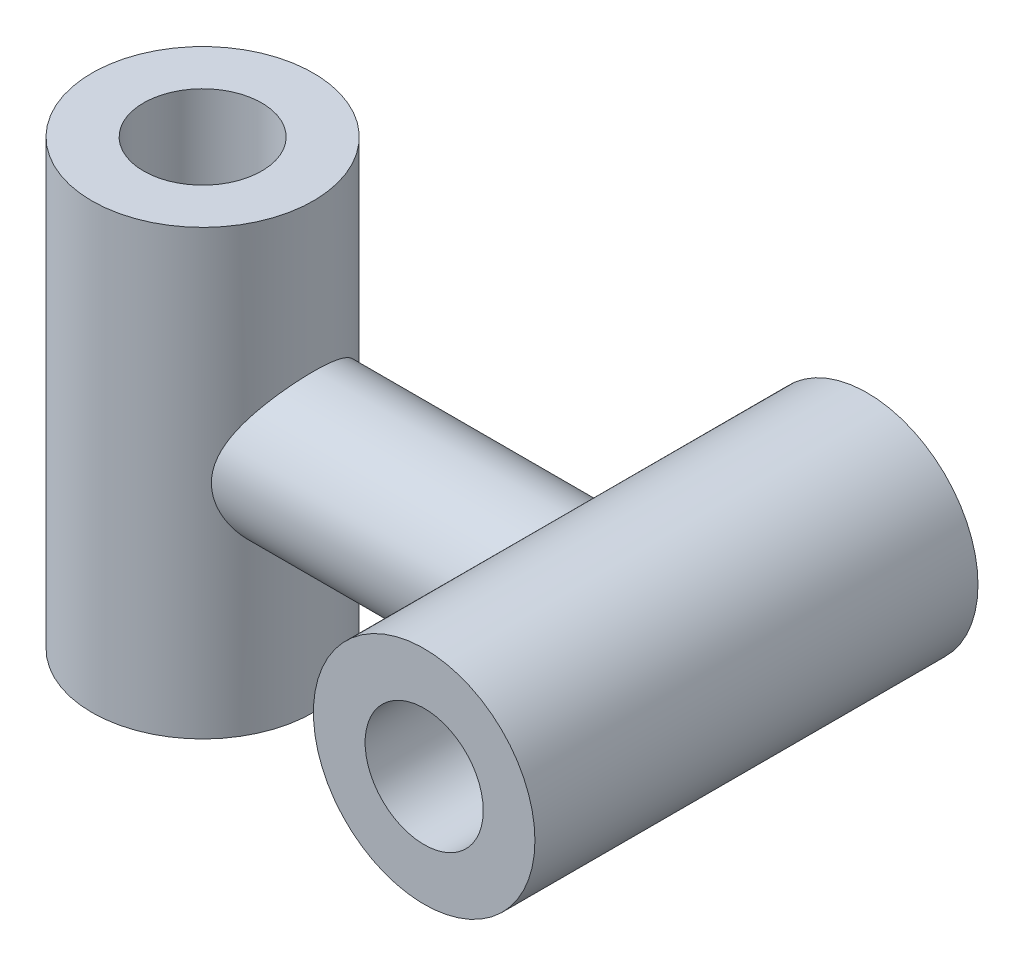
ISO-10303-21;
HEADER;
FILE_DESCRIPTION(('STEP AP214'),'2;1');
FILE_NAME('part.step','',(''),(''),'','','');
FILE_SCHEMA(('AUTOMOTIVE_DESIGN { 1 0 10303 214 1 1 1 1 }'));
ENDSEC;
DATA;
#1=APPLICATION_CONTEXT('core data for automotive mechanical design processes');
#2=APPLICATION_PROTOCOL_DEFINITION('international standard','automotive_design',2000,#1);
#3=PRODUCT_CONTEXT('',#1,'mechanical');
#4=PRODUCT('Part','Part','',(#3));
#5=PRODUCT_RELATED_PRODUCT_CATEGORY('part','',(#4));
#6=PRODUCT_DEFINITION_FORMATION('','',#4);
#7=PRODUCT_DEFINITION_CONTEXT('part definition',#1,'design');
#8=PRODUCT_DEFINITION('design','',#6,#7);
#9=PRODUCT_DEFINITION_SHAPE('','',#8);
#10=(LENGTH_UNIT() NAMED_UNIT(*) SI_UNIT(.MILLI.,.METRE.));
#11=(NAMED_UNIT(*) PLANE_ANGLE_UNIT() SI_UNIT($,.RADIAN.));
#12=(NAMED_UNIT(*) SI_UNIT($,.STERADIAN.) SOLID_ANGLE_UNIT());
#13=UNCERTAINTY_MEASURE_WITH_UNIT(LENGTH_MEASURE(1.E-05),#10,'distance_accuracy_value','');
#14=(GEOMETRIC_REPRESENTATION_CONTEXT(3) GLOBAL_UNCERTAINTY_ASSIGNED_CONTEXT((#13)) GLOBAL_UNIT_ASSIGNED_CONTEXT((#10,
#11,#12)) REPRESENTATION_CONTEXT('',''));
#15=CARTESIAN_POINT('',(0.,0.,0.));
#16=DIRECTION('',(0.,0.,1.));
#17=DIRECTION('',(1.,0.,0.));
#18=AXIS2_PLACEMENT_3D('',#15,#16,#17);
#19=CARTESIAN_POINT('',(0.,30.,0.));
#20=DIRECTION('',(0.,-1.,0.));
#21=DIRECTION('',(0.,0.,-1.));
#22=AXIS2_PLACEMENT_3D('',#19,#20,#21);
#23=CYLINDRICAL_SURFACE('',#22,15.);
#24=CARTESIAN_POINT('',(0.,30.,0.));
#25=DIRECTION('',(0.,1.,0.));
#26=DIRECTION('',(0.,0.,1.));
#27=AXIS2_PLACEMENT_3D('',#24,#25,#26);
#28=CIRCLE('',#27,15.);
#29=CARTESIAN_POINT('',(0.,30.,15.));
#30=VERTEX_POINT('',#29);
#31=EDGE_CURVE('E44',#30,#30,#28,.T.);
#32=ORIENTED_EDGE('',*,*,#31,.F.);
#33=EDGE_LOOP('',(#32));
#34=FACE_BOUND('',#33,.T.);
#35=CARTESIAN_POINT('',(0.,-30.,0.));
#36=DIRECTION('',(0.,1.,0.));
#37=DIRECTION('',(0.,0.,1.));
#38=AXIS2_PLACEMENT_3D('',#35,#36,#37);
#39=CIRCLE('',#38,15.);
#40=CARTESIAN_POINT('',(0.,-30.,15.));
#41=VERTEX_POINT('',#40);
#42=EDGE_CURVE('E48',#41,#41,#39,.T.);
#43=ORIENTED_EDGE('',*,*,#42,.T.);
#44=EDGE_LOOP('',(#43));
#45=FACE_BOUND('',#44,.T.);
#46=CARTESIAN_POINT('',(11.1803398874989,0.,10.));
#47=CARTESIAN_POINT('',(11.1803430259406,-0.244104634083735,9.99999812169869));
#48=CARTESIAN_POINT('',(11.1883710861167,-0.488234877021476,9.99104298688126));
#49=CARTESIAN_POINT('',(11.2200794062258,-0.9741786748761,9.95541902056754));
#50=CARTESIAN_POINT('',(11.2437621621503,-1.21599185412102,9.92874736433802));
#51=CARTESIAN_POINT('',(11.3056682657664,-1.69550479304914,9.85819750719936));
#52=CARTESIAN_POINT('',(11.3439099993903,-1.93319895251672,9.81429754720628));
#53=CARTESIAN_POINT('',(11.4332421002341,-2.40254294819922,9.71008060552601));
#54=CARTESIAN_POINT('',(11.4843390943081,-2.63418959874925,9.64975515521691));
#55=CARTESIAN_POINT('',(11.6527900284438,-3.31335090278491,9.4468623449172));
#56=CARTESIAN_POINT('',(11.7860548834697,-3.75031310169313,9.28157856239411));
#57=CARTESIAN_POINT('',(12.0792279451741,-4.5894545697837,8.89665774912812));
#58=CARTESIAN_POINT('',(12.2391416827651,-4.99162659197015,8.67700943055291));
#59=CARTESIAN_POINT('',(12.5013264947166,-5.59668354535961,8.29133076792019));
#60=CARTESIAN_POINT('',(12.5994659827145,-5.81208580089952,8.14175321020326));
#61=CARTESIAN_POINT('',(12.7975948813315,-6.22995308437642,7.82663116288371));
#62=CARTESIAN_POINT('',(12.8975839505731,-6.4324204695781,7.66108959645801));
#63=CARTESIAN_POINT('',(13.0973129788288,-6.82407478250954,7.31440150407201));
#64=CARTESIAN_POINT('',(13.1970525692878,-7.01324763966897,7.13323888356034));
#65=CARTESIAN_POINT('',(13.3941287851115,-7.37740647406724,6.75593222846197));
#66=CARTESIAN_POINT('',(13.491465244404,-7.55239147273011,6.55978716230338));
#67=CARTESIAN_POINT('',(13.6955602327301,-7.91159105003276,6.12353647276973));
#68=CARTESIAN_POINT('',(13.8016407482454,-8.09346990419511,5.8811789501792));
#69=CARTESIAN_POINT('',(14.0051991409564,-8.43590832447264,5.37846826366159));
#70=CARTESIAN_POINT('',(14.1026781086509,-8.59647059439672,5.1181173884048));
#71=CARTESIAN_POINT('',(14.2862255770416,-8.89437994302583,4.58085923760313));
#72=CARTESIAN_POINT('',(14.3723022122588,-9.03174359126861,4.30396397184124));
#73=CARTESIAN_POINT('',(14.5304784366757,-9.28138637708527,3.73526924944096));
#74=CARTESIAN_POINT('',(14.6025810193416,-9.39367088779998,3.44347300179123));
#75=CARTESIAN_POINT('',(14.7232499779965,-9.58011201957957,2.8808291650135));
#76=CARTESIAN_POINT('',(14.7735488698848,-9.6571320762623,2.6113011354144));
#77=CARTESIAN_POINT('',(14.8598203562673,-9.78860194671832,2.0645333689058));
#78=CARTESIAN_POINT('',(14.89579391716,-9.84305328300618,1.78729415354961));
#79=CARTESIAN_POINT('',(14.9522937545745,-9.9283487325306,1.22794421558455));
#80=CARTESIAN_POINT('',(14.9728362005759,-9.95921755725901,0.945838909986497));
#81=CARTESIAN_POINT('',(14.9978816517682,-9.99683236708492,0.379329542124272));
#82=CARTESIAN_POINT('',(15.0023869200542,-10.0035817558104,0.0949258098814438));
#83=CARTESIAN_POINT('',(14.9957738626236,-9.99365946358264,-0.429890300704853));
#84=CARTESIAN_POINT('',(14.9869306329571,-9.98039844294295,-0.670405365119609));
#85=CARTESIAN_POINT('',(14.9578376639306,-9.9366582762118,-1.14916921336002));
#86=CARTESIAN_POINT('',(14.9375881746366,-9.9061795075949,-1.38741804675311));
#87=CARTESIAN_POINT('',(14.8861382248988,-9.82842604583959,-1.85994144315074));
#88=CARTESIAN_POINT('',(14.8549378760396,-9.78115152384267,-2.09421604662547));
#89=CARTESIAN_POINT('',(14.7822617239678,-9.67041911018337,-2.55727832292994));
#90=CARTESIAN_POINT('',(14.7407854766754,-9.60696051911227,-2.78606575815929));
#91=CARTESIAN_POINT('',(14.6486073339022,-9.46491431896903,-3.23586010547906));
#92=CARTESIAN_POINT('',(14.5979453417989,-9.38639206481311,-3.45689591892768));
#93=CARTESIAN_POINT('',(14.4882322586955,-9.21483712594955,-3.89118359906177));
#94=CARTESIAN_POINT('',(14.4291784106703,-9.12179967149181,-4.10443287853565));
#95=CARTESIAN_POINT('',(14.3037704301121,-8.9221009344861,-4.5221336999245));
#96=CARTESIAN_POINT('',(14.2374182594116,-8.81544331188517,-4.72658758563683));
#97=CARTESIAN_POINT('',(14.0984944675164,-8.58926725934447,-5.12613031066347));
#98=CARTESIAN_POINT('',(14.0259206268545,-8.46974423598901,-5.32121576891783));
#99=CARTESIAN_POINT('',(13.8658792207725,-8.20216850951354,-5.726327688562));
#100=CARTESIAN_POINT('',(13.7777061138305,-8.05242961838,-5.93496271084412));
#101=CARTESIAN_POINT('',(13.5965782636545,-7.73843625985692,-6.33893458542772));
#102=CARTESIAN_POINT('',(13.5036213978756,-7.57417532544927,-6.53426544381383));
#103=CARTESIAN_POINT('',(13.3145874937375,-7.23178051029879,-6.91131642999311));
#104=CARTESIAN_POINT('',(13.2185061682784,-7.05362705509659,-7.09301661883702));
#105=CARTESIAN_POINT('',(13.0252308837189,-6.68441263242746,-7.44198477597034));
#106=CARTESIAN_POINT('',(12.928037297742,-6.49335589388961,-7.60925743221258));
#107=CARTESIAN_POINT('',(12.719374739405,-6.06811166266616,-7.95387515273785));
#108=CARTESIAN_POINT('',(12.6080378855717,-5.83183895186575,-8.12873711272969));
#109=CARTESIAN_POINT('',(12.3896668251086,-5.34336756923514,-8.45784659868074));
#110=CARTESIAN_POINT('',(12.2826335903347,-5.09116533284389,-8.61208948645936));
#111=CARTESIAN_POINT('',(12.0766788127789,-4.57196567585117,-8.89859009264868));
#112=CARTESIAN_POINT('',(11.9777446551158,-4.30499239286441,-9.03088234401941));
#113=CARTESIAN_POINT('',(11.7917874904154,-3.75668599376629,-9.27237806459456));
#114=CARTESIAN_POINT('',(11.7047650399248,-3.47535220753653,-9.38158045510896));
#115=CARTESIAN_POINT('',(11.5694871684616,-2.98197209563972,-9.54750949240308));
#116=CARTESIAN_POINT('',(11.5172535222626,-2.77304680410482,-9.61031997608976));
#117=CARTESIAN_POINT('',(11.4226872575468,-2.34953877611093,-9.72253074540317));
#118=CARTESIAN_POINT('',(11.3803483069507,-2.13495975612472,-9.77193961062346));
#119=CARTESIAN_POINT('',(11.3070401848808,-1.70139224710652,-9.85667224549281));
#120=CARTESIAN_POINT('',(11.2760568528539,-1.48240961155064,-9.89201356226248));
#121=CARTESIAN_POINT('',(11.2265751582085,-1.04116868276131,-9.94813645210465));
#122=CARTESIAN_POINT('',(11.208076846047,-0.81891037629326,-9.96891796633514));
#123=CARTESIAN_POINT('',(11.1842832880714,-0.371800856476383,-9.99560576163432));
#124=CARTESIAN_POINT('',(11.1790466259839,-0.146942530983489,-10.0014460405136));
#125=CARTESIAN_POINT('',(11.1821746476658,0.302560059924555,-9.99794852994014));
#126=CARTESIAN_POINT('',(11.1905393640475,0.527204324825155,-9.98861070409458));
#127=CARTESIAN_POINT('',(11.2205177549356,0.974621641486337,-9.95492255357889));
#128=CARTESIAN_POINT('',(11.242140871207,1.19739324495086,-9.93056153029915));
#129=CARTESIAN_POINT('',(11.2977494335487,1.63926939557589,-9.86725009281896));
#130=CARTESIAN_POINT('',(11.3317350862712,1.85837388137277,-9.82829943473768));
#131=CARTESIAN_POINT('',(11.4088330115491,2.28089485594372,-9.73867716321877));
#132=CARTESIAN_POINT('',(11.4514130385869,2.48455237317497,-9.6886776896265));
#133=CARTESIAN_POINT('',(11.5452839732015,2.88648788657469,-9.57662600790573));
#134=CARTESIAN_POINT('',(11.5965778438525,3.08476402616079,-9.51456969891009));
#135=CARTESIAN_POINT('',(11.7614678812668,3.67047748529836,-9.31119036842247));
#136=CARTESIAN_POINT('',(11.88611412818,4.04901435576876,-9.15261057859001));
#137=CARTESIAN_POINT('',(12.1002928870001,4.63234315096139,-8.86571968225689));
#138=CARTESIAN_POINT('',(12.1839462589038,4.84610463934114,-8.75064580817113));
#139=CARTESIAN_POINT('',(12.3558679534822,5.26341966050907,-8.50616497543068));
#140=CARTESIAN_POINT('',(12.444136699054,5.46697225451771,-8.37675670212528));
#141=CARTESIAN_POINT('',(12.6234213220345,5.86362637103519,-8.10406654501133));
#142=CARTESIAN_POINT('',(12.7144400860823,6.05671627224182,-7.96076970794572));
#143=CARTESIAN_POINT('',(12.8973566889103,6.43184385461757,-7.66087764301209));
#144=CARTESIAN_POINT('',(12.9892545762662,6.61388092093514,-7.50428167649493));
#145=CARTESIAN_POINT('',(13.1922876017012,7.00501199367108,-7.14251026043375));
#146=CARTESIAN_POINT('',(13.3032350001165,7.21131788333414,-6.93419991939919));
#147=CARTESIAN_POINT('',(13.521145454981,7.605813647227,-6.49906525353764));
#148=CARTESIAN_POINT('',(13.6281077760494,7.79400018787884,-6.27223753603491));
#149=CARTESIAN_POINT('',(13.8352560142781,8.15079051936007,-5.80102421685026));
#150=CARTESIAN_POINT('',(13.9354465792144,8.3194077996857,-5.55665090006567));
#151=CARTESIAN_POINT('',(14.1264958022064,8.63560945832402,-5.05124190702963));
#152=CARTESIAN_POINT('',(14.217356960693,8.78319947641232,-4.79021072592579));
#153=CARTESIAN_POINT('',(14.3709171071375,9.02943198743409,-4.30448556628466));
#154=CARTESIAN_POINT('',(14.4356734256277,9.13203130163217,-4.08244035052509));
#155=CARTESIAN_POINT('',(14.5561930387882,9.32137816893595,-3.62934795833055));
#156=CARTESIAN_POINT('',(14.6119580128621,9.40812868268456,-3.39830247299899));
#157=CARTESIAN_POINT('',(14.7133038660206,9.564772630882,-2.92854633040624));
#158=CARTESIAN_POINT('',(14.7588912010778,9.63467675373536,-2.68984064278837));
#159=CARTESIAN_POINT('',(14.8389093359148,9.75681098257684,-2.20609679271157));
#160=CARTESIAN_POINT('',(14.8733399738452,9.80904083216604,-1.96105853844224));
#161=CARTESIAN_POINT('',(14.9303555987578,9.89528026301976,-1.46527060531758));
#162=CARTESIAN_POINT('',(14.9528864973692,9.92920666361757,-1.21450016236396));
#163=CARTESIAN_POINT('',(14.9853029119545,9.97795750179072,-0.710289408341561));
#164=CARTESIAN_POINT('',(14.9951884079085,9.9927819091241,-0.456849093046522));
#165=CARTESIAN_POINT('',(15.0020606199943,10.0030913961553,0.0505846961655471));
#166=CARTESIAN_POINT('',(14.999048104548,9.99857762795915,0.304578136228097));
#167=CARTESIAN_POINT('',(14.9802028125407,9.97028527280906,0.810999942975642));
#168=CARTESIAN_POINT('',(14.9643706194314,9.94650756259925,1.0634283803605));
#169=CARTESIAN_POINT('',(14.9218992832392,9.88248971342065,1.54639987516089));
#170=CARTESIAN_POINT('',(14.896131463701,9.84357507465467,1.77719759813669));
#171=CARTESIAN_POINT('',(14.8344725250113,9.75001605952977,2.23418451613698));
#172=CARTESIAN_POINT('',(14.7985819943102,9.69537259751012,2.46037397822816));
#173=CARTESIAN_POINT('',(14.7174040805464,9.5710083281068,2.90680088706522));
#174=CARTESIAN_POINT('',(14.6721176912708,9.50128911523188,3.12703896049922));
#175=CARTESIAN_POINT('',(14.5729891556913,9.34748470402443,3.56054098474612));
#176=CARTESIAN_POINT('',(14.5191436785366,9.26339391189295,3.7738021813197));
#177=CARTESIAN_POINT('',(14.4005595091565,9.07643294016643,4.20435065529125));
#178=CARTESIAN_POINT('',(14.3353729442401,8.97276186320522,4.42116634154645));
#179=CARTESIAN_POINT('',(14.1977124408276,8.7511474570407,4.84506473833997));
#180=CARTESIAN_POINT('',(14.1252354589144,8.63319816311673,5.05214333070681));
#181=CARTESIAN_POINT('',(13.974270364515,8.38391755943982,5.45584279844943));
#182=CARTESIAN_POINT('',(13.8957808577344,8.25258314335166,5.65246123010944));
#183=CARTESIAN_POINT('',(13.7341089343567,7.97735246721627,6.03467657516069));
#184=CARTESIAN_POINT('',(13.6509259922911,7.83345479961898,6.22027224967031));
#185=CARTESIAN_POINT('',(13.4678412146332,7.51020568644261,6.60834585726705));
#186=CARTESIAN_POINT('',(13.3673693594744,7.32883957137959,6.80887991263904));
#187=CARTESIAN_POINT('',(13.1641137688582,6.95120233992227,7.19399132903166));
#188=CARTESIAN_POINT('',(13.0613305240975,6.75493436648316,7.37857203731309));
#189=CARTESIAN_POINT('',(12.8555936943145,6.34800274615306,7.73145903758046));
#190=CARTESIAN_POINT('',(12.7526400392432,6.13732629941372,7.89975052986546));
#191=CARTESIAN_POINT('',(12.5490927023051,5.70233922468843,8.21925441084574));
#192=CARTESIAN_POINT('',(12.4484987926332,5.47802992036076,8.37046845358406));
#193=CARTESIAN_POINT('',(12.2598113631537,5.03390836898575,8.6442187927183));
#194=CARTESIAN_POINT('',(12.1713497005758,4.81505896437095,8.76806290035353));
#195=CARTESIAN_POINT('',(12.0009992344934,4.36657776521144,8.99981674145526));
#196=CARTESIAN_POINT('',(11.9191106288249,4.13694564645788,9.10772599539628));
#197=CARTESIAN_POINT('',(11.7645406627919,3.66788226081282,9.30652559170292));
#198=CARTESIAN_POINT('',(11.691844701299,3.42846735367454,9.397443035655));
#199=CARTESIAN_POINT('',(11.558159950346,2.94041923146926,9.56138824931114));
#200=CARTESIAN_POINT('',(11.4971679739321,2.69178854788988,9.6344208904837));
#201=CARTESIAN_POINT('',(11.401437026276,2.24269134510791,9.74738067057191));
#202=CARTESIAN_POINT('',(11.3638755290469,2.04376372943437,9.79105763878781));
#203=CARTESIAN_POINT('',(11.2985465655896,1.64207066548911,9.8663741573746));
#204=CARTESIAN_POINT('',(11.2707771768695,1.43930597879831,9.89801607069264));
#205=CARTESIAN_POINT('',(11.2259569924442,1.03112886292084,9.94882125186978));
#206=CARTESIAN_POINT('',(11.208901196452,0.82571771465238,9.96799034124066));
#207=CARTESIAN_POINT('',(11.186093076677,0.413543541943227,9.99357852338843));
#208=CARTESIAN_POINT('',(11.180337228926,0.206780959145195,10.0000015911085));
#209=CARTESIAN_POINT('',(11.1803398874989,0.,10.));
#210=B_SPLINE_CURVE_WITH_KNOTS('',3,(#46,#47,#48,#49,#50,#51,#52,#53,#54,#55,#56,#57,#58,#59,
#60,#61,#62,#63,#64,#65,#66,#67,#68,#69,#70,#71,#72,#73,#74,#75,#76,#77,#78,#79,#80,#81,#82,#83,
#84,#85,#86,#87,#88,#89,#90,#91,#92,#93,#94,#95,#96,#97,#98,#99,#100,#101,#102,#103,#104,#105,
#106,#107,#108,#109,#110,#111,#112,#113,#114,#115,#116,#117,#118,#119,#120,#121,#122,#123,#124,
#125,#126,#127,#128,#129,#130,#131,#132,#133,#134,#135,#136,#137,#138,#139,#140,#141,#142,#143,
#144,#145,#146,#147,#148,#149,#150,#151,#152,#153,#154,#155,#156,#157,#158,#159,#160,#161,#162,
#163,#164,#165,#166,#167,#168,#169,#170,#171,#172,#173,#174,#175,#176,#177,#178,#179,#180,#181,
#182,#183,#184,#185,#186,#187,#188,#189,#190,#191,#192,#193,#194,#195,#196,#197,#198,#199,#200,
#201,#202,#203,#204,#205,#206,#207,#208,#209),.UNSPECIFIED.,.T.,.F.,(4,2,2,2,2,2,2,2,2,2,2,2,2,
2,2,2,2,2,2,2,2,2,2,2,2,2,2,2,2,2,2,2,2,2,2,2,2,2,2,2,2,2,2,2,2,2,2,2,2,2,2,2,2,2,2,2,2,2,2,2,2,
2,2,2,2,2,2,2,2,2,2,2,2,2,2,2,2,2,2,2,2,4),(0.,0.732066917349117,1.46425058392996,
2.19736197880351,2.93085206787207,4.382020112657,5.83348971990308,6.672838976924,
7.51203483110182,8.35210589301702,9.19223484776161,10.1540803360742,11.1158037065051,
12.0768372372204,13.0376646710422,13.8907601737504,14.743798116181,15.5959409519091,
16.4479635322652,17.1702156788431,17.8924519916876,18.6146809454662,19.3369411162915,
20.0561358131717,20.7755673398783,21.4948059495621,22.214302210737,23.0280693671007,
23.8422007569148,24.6575007309406,25.4725347827911,26.414397305266,27.356471340832,
28.2970489476923,29.2376704858531,29.9100432897782,30.5819846253405,31.2530851702129,
31.9241884272576,32.5982511716858,33.2723155323322,33.9468604759259,34.6214166957388,
35.2627334392751,35.9042686956598,37.1866749927096,37.9564914842844,38.7263786365849,
39.4971041032807,40.267872404997,41.207188569845,42.1466772201539,43.0855143659072,
44.0240992277863,44.7824339087838,45.5406267835279,46.2983373392933,47.056058886619,
47.8171955242766,48.5783333669519,49.339425864123,50.100483724255,50.806097715443,
51.5116706965499,52.2171690881724,52.922942706437,53.6692292388338,54.4158286150966,
55.1626016537189,55.9094584662437,56.7739254797706,57.6382106720938,58.5032738884594,
59.3682532468017,60.1672315187865,60.9662338294224,61.7639506641025,62.5614499741256,
63.1821889251969,63.8028059381941,64.4231330789218,65.0432667355241),.UNSPECIFIED.);
#211=CARTESIAN_POINT('',(11.1803398874989,0.,10.));
#212=VERTEX_POINT('',#211);
#213=EDGE_CURVE('E10',#212,#212,#210,.T.);
#214=ORIENTED_EDGE('',*,*,#213,.F.);
#215=EDGE_LOOP('',(#214));
#216=FACE_BOUND('',#215,.T.);
#217=ADVANCED_FACE('F33',(#34,#45,#216),#23,.T.);
#218=CARTESIAN_POINT('',(0.,30.,0.));
#219=DIRECTION('',(0.,1.,0.));
#220=DIRECTION('',(0.,0.,1.));
#221=AXIS2_PLACEMENT_3D('',#218,#219,#220);
#222=PLANE('',#221);
#223=ORIENTED_EDGE('',*,*,#31,.T.);
#224=EDGE_LOOP('',(#223));
#225=FACE_BOUND('',#224,.T.);
#226=CARTESIAN_POINT('',(0.,30.,0.));
#227=DIRECTION('',(0.,1.,0.));
#228=DIRECTION('',(0.,0.,1.));
#229=AXIS2_PLACEMENT_3D('',#226,#227,#228);
#230=CIRCLE('',#229,8.);
#231=CARTESIAN_POINT('',(0.,30.,8.));
#232=VERTEX_POINT('',#231);
#233=EDGE_CURVE('E53',#232,#232,#230,.T.);
#234=ORIENTED_EDGE('',*,*,#233,.F.);
#235=EDGE_LOOP('',(#234));
#236=FACE_BOUND('',#235,.T.);
#237=ADVANCED_FACE('F95',(#225,#236),#222,.T.);
#238=CARTESIAN_POINT('',(0.,-30.,0.));
#239=DIRECTION('',(0.,1.,0.));
#240=DIRECTION('',(0.,0.,1.));
#241=AXIS2_PLACEMENT_3D('',#238,#239,#240);
#242=PLANE('',#241);
#243=ORIENTED_EDGE('',*,*,#42,.F.);
#244=EDGE_LOOP('',(#243));
#245=FACE_BOUND('',#244,.T.);
#246=CARTESIAN_POINT('',(0.,-30.,0.));
#247=DIRECTION('',(0.,1.,0.));
#248=DIRECTION('',(0.,0.,1.));
#249=AXIS2_PLACEMENT_3D('',#246,#247,#248);
#250=CIRCLE('',#249,8.);
#251=CARTESIAN_POINT('',(0.,-30.,8.));
#252=VERTEX_POINT('',#251);
#253=EDGE_CURVE('E55',#252,#252,#250,.T.);
#254=ORIENTED_EDGE('',*,*,#253,.T.);
#255=EDGE_LOOP('',(#254));
#256=FACE_BOUND('',#255,.T.);
#257=ADVANCED_FACE('F102',(#245,#256),#242,.F.);
#258=CARTESIAN_POINT('',(0.,30.,0.));
#259=DIRECTION('',(0.,-1.,0.));
#260=DIRECTION('',(0.,0.,-1.));
#261=AXIS2_PLACEMENT_3D('',#258,#259,#260);
#262=CYLINDRICAL_SURFACE('',#261,8.);
#263=ORIENTED_EDGE('',*,*,#233,.T.);
#264=EDGE_LOOP('',(#263));
#265=FACE_BOUND('',#264,.T.);
#266=ORIENTED_EDGE('',*,*,#253,.F.);
#267=EDGE_LOOP('',(#266));
#268=FACE_BOUND('',#267,.T.);
#269=ADVANCED_FACE('F110',(#265,#268),#262,.F.);
#270=CARTESIAN_POINT('',(75.002,0.,0.));
#271=DIRECTION('',(-1.,0.,0.));
#272=DIRECTION('',(0.,0.,1.));
#273=AXIS2_PLACEMENT_3D('',#270,#271,#272);
#274=CYLINDRICAL_SURFACE('',#273,10.);
#275=ORIENTED_EDGE('',*,*,#213,.T.);
#276=EDGE_LOOP('',(#275));
#277=FACE_BOUND('',#276,.T.);
#278=CARTESIAN_POINT('',(45.,0.,10.));
#279=CARTESIAN_POINT('',(45.0000000669645,-0.25121602505803,9.99999993534951));
#280=CARTESIAN_POINT('',(45.0063243617413,-0.502433296411791,9.99052094502158));
#281=CARTESIAN_POINT('',(45.031462274509,-1.00281430621742,9.95275435405694));
#282=CARTESIAN_POINT('',(45.050275958235,-1.25197803385393,9.92446665442466));
#283=CARTESIAN_POINT('',(45.099937392702,-1.74639437147615,9.84950014434954));
#284=CARTESIAN_POINT('',(45.1307898344581,-1.99164541802644,9.80281416477334));
#285=CARTESIAN_POINT('',(45.2037950671594,-2.47636835109205,9.69171976038695));
#286=CARTESIAN_POINT('',(45.2459479947457,-2.71584016768893,9.62731112128079));
#287=CARTESIAN_POINT('',(45.3403774321265,-3.18634157579506,9.48196024055735));
#288=CARTESIAN_POINT('',(45.3926046164158,-3.41740603302261,9.40109845501636));
#289=CARTESIAN_POINT('',(45.5062163332863,-3.87103535608821,9.22357931716256));
#290=CARTESIAN_POINT('',(45.5676008184902,-4.09360026589291,9.12692204657064));
#291=CARTESIAN_POINT('',(45.6983175545653,-4.52919238259836,8.91878234381083));
#292=CARTESIAN_POINT('',(45.7676485304992,-4.74222111188151,8.80730228935662));
#293=CARTESIAN_POINT('',(45.913024921277,-5.15806897823306,8.57039192321527));
#294=CARTESIAN_POINT('',(45.9890728329744,-5.36088427435106,8.44495641940083));
#295=CARTESIAN_POINT('',(46.153204506932,-5.77229179252596,8.16988010712301));
#296=CARTESIAN_POINT('',(46.2417623569089,-5.97992610161554,8.01908981242674));
#297=CARTESIAN_POINT('',(46.4235310029667,-6.38186231730967,7.70306611819707));
#298=CARTESIAN_POINT('',(46.5167437996112,-6.57615840484502,7.5378264854341));
#299=CARTESIAN_POINT('',(46.7061483110135,-6.95109161684713,7.19355182648485));
#300=CARTESIAN_POINT('',(46.8023438277028,-7.13171020600086,7.01449872097468));
#301=CARTESIAN_POINT('',(46.9957106530528,-7.47849345473134,6.6435373382512));
#302=CARTESIAN_POINT('',(47.0928816362889,-7.64466276695229,6.45163323453413));
#303=CARTESIAN_POINT('',(47.3015816678293,-7.98727084465364,6.02411381532355));
#304=CARTESIAN_POINT('',(47.4129517256033,-8.16117931320374,5.78638467561562));
#305=CARTESIAN_POINT('',(47.6311530390378,-8.48824389065339,5.29498288365453));
#306=CARTESIAN_POINT('',(47.7379832603163,-8.64139528736315,5.04130663021886));
#307=CARTESIAN_POINT('',(47.9432463321329,-8.92554542356295,4.51916377060268));
#308=CARTESIAN_POINT('',(48.041692574713,-9.05657983313836,4.25072192372748));
#309=CARTESIAN_POINT('',(48.2263447510574,-9.2953668655437,3.6995014922921));
#310=CARTESIAN_POINT('',(48.3125502429854,-9.4031186480483,3.41672239072095));
#311=CARTESIAN_POINT('',(48.445835592816,-9.56603073076105,2.92197512669334));
#312=CARTESIAN_POINT('',(48.4970252142702,-9.62739262612926,2.71313958691548));
#313=CARTESIAN_POINT('',(48.5894246890727,-9.73672940324514,2.289937274223));
#314=CARTESIAN_POINT('',(48.6306409488442,-9.78471288169701,2.07557415043356));
#315=CARTESIAN_POINT('',(48.7016578564507,-9.86663115695275,1.6425809785492));
#316=CARTESIAN_POINT('',(48.7314726432132,-9.90058335814109,1.42395657095979));
#317=CARTESIAN_POINT('',(48.778612408099,-9.95398099415626,0.983588730911827));
#318=CARTESIAN_POINT('',(48.7959373177741,-9.97342634948116,0.761845281366752));
#319=CARTESIAN_POINT('',(48.8174210972258,-9.99750949727822,0.315986902566632));
#320=CARTESIAN_POINT('',(48.8215251491214,-10.0020856379335,0.0918659554353711));
#321=CARTESIAN_POINT('',(48.8162349155655,-9.9961699136916,-0.356015329671864));
#322=CARTESIAN_POINT('',(48.8068405842626,-9.98567799761094,-0.579775666420325));
#323=CARTESIAN_POINT('',(48.7749456570746,-9.94981025476011,-1.02531254772308));
#324=CARTESIAN_POINT('',(48.7524353227886,-9.92442336863968,-1.24708749379653));
#325=CARTESIAN_POINT('',(48.6952209173834,-9.85920094420808,-1.68688746328602));
#326=CARTESIAN_POINT('',(48.6605166137054,-9.81936513033175,-1.90491241510033));
#327=CARTESIAN_POINT('',(48.5819980905486,-9.72793320006853,-2.32630776900133));
#328=CARTESIAN_POINT('',(48.5386582408607,-9.67693962238987,-2.52989845513065));
#329=CARTESIAN_POINT('',(48.4433431142662,-9.56290804839144,-2.93162712247606));
#330=CARTESIAN_POINT('',(48.3913648957537,-9.49986594811239,-3.12976321936933));
#331=CARTESIAN_POINT('',(48.2245497380555,-9.29354494113033,-3.7149653297061));
#332=CARTESIAN_POINT('',(48.0987895496512,-9.13302364641689,-4.09304089571523));
#333=CARTESIAN_POINT('',(47.8828714872654,-8.84272153741117,-4.67614375859801));
#334=CARTESIAN_POINT('',(47.7984612450931,-8.72612786560377,-4.89016265101236));
#335=CARTESIAN_POINT('',(47.6251282637458,-8.47852404512043,-5.30787405322557));
#336=CARTESIAN_POINT('',(47.5362050991695,-8.34751253601214,-5.51156558590632));
#337=CARTESIAN_POINT('',(47.3557259488922,-8.07152743445186,-5.90837865949047));
#338=CARTESIAN_POINT('',(47.2641671565478,-7.92653854045352,-6.10148824490794));
#339=CARTESIAN_POINT('',(47.0803005126694,-7.62317723911379,-6.47652189877409));
#340=CARTESIAN_POINT('',(46.9879926216157,-7.46480412146614,-6.658445372685));
#341=CARTESIAN_POINT('',(46.7844751133833,-7.09947419488299,-7.04865159805946));
#342=CARTESIAN_POINT('',(46.6734848022249,-6.88940798266188,-7.25415168380683));
#343=CARTESIAN_POINT('',(46.4557017331315,-6.45073383646428,-7.64687567157477));
#344=CARTESIAN_POINT('',(46.3489097500501,-6.22212250338513,-7.83409620924893));
#345=CARTESIAN_POINT('',(46.1423299325073,-5.74734305844846,-8.18875916118422));
#346=CARTESIAN_POINT('',(46.0425369884162,-5.50118802469018,-8.35621606611875));
#347=CARTESIAN_POINT('',(45.8525161863449,-4.99223677264768,-8.66988260769791));
#348=CARTESIAN_POINT('',(45.7622856983733,-4.72944516189957,-8.81609809055921));
#349=CARTESIAN_POINT('',(45.6104153842833,-4.24166531219499,-9.05909913410104));
#350=CARTESIAN_POINT('',(45.5466380536587,-4.01936273392654,-9.15995597951621));
#351=CARTESIAN_POINT('',(45.4281374435537,-3.5659086899693,-9.34581764481726));
#352=CARTESIAN_POINT('',(45.373412462063,-3.3347588978084,-9.43082544500166));
#353=CARTESIAN_POINT('',(45.2741861253619,-2.86496136705682,-9.58399689634911));
#354=CARTESIAN_POINT('',(45.2296782665674,-2.6263185086893,-9.65217126472845));
#355=CARTESIAN_POINT('',(45.1518347251002,-2.14287716114343,-9.7708761960258));
#356=CARTESIAN_POINT('',(45.11849921429,-1.89807857733481,-9.82140648752831));
#357=CARTESIAN_POINT('',(45.0636710525903,-1.40298657198256,-9.90428665687824));
#358=CARTESIAN_POINT('',(45.0422308396901,-1.15267379959939,-9.9365560475488));
#359=CARTESIAN_POINT('',(45.011952198909,-0.649559957245915,-9.98207727619356));
#360=CARTESIAN_POINT('',(45.0031137874946,-0.396758884024639,-9.99532908931791));
#361=CARTESIAN_POINT('',(44.9982641024208,0.109232368114867,-10.0026040164575));
#362=CARTESIAN_POINT('',(45.0022523000737,0.362422530565648,-9.99662792300954));
#363=CARTESIAN_POINT('',(45.0229533385098,0.867090784232965,-9.96554372761836));
#364=CARTESIAN_POINT('',(45.0396656362014,1.11856894805903,-9.94043644223491));
#365=CARTESIAN_POINT('',(45.0837792743253,1.60021088099169,-9.8739156350187));
#366=CARTESIAN_POINT('',(45.1103454966847,1.83062905444839,-9.83377417424126));
#367=CARTESIAN_POINT('',(45.1735446771129,2.286750791688,-9.73781705393653));
#368=CARTESIAN_POINT('',(45.2101770685625,2.51245462006971,-9.6820022766482));
#369=CARTESIAN_POINT('',(45.2927707127616,2.95782054801539,-9.55535953808213));
#370=CARTESIAN_POINT('',(45.3387310027694,3.17748326843354,-9.48453312613683));
#371=CARTESIAN_POINT('',(45.4391314255019,3.609760336539,-9.3285826248577));
#372=CARTESIAN_POINT('',(45.4935748573436,3.82237190283185,-9.24345297194153));
#373=CARTESIAN_POINT('',(45.6134635531422,4.25209030381565,-9.05417659982018));
#374=CARTESIAN_POINT('',(45.6793734461535,4.4686990221519,-8.94919430778672));
#375=CARTESIAN_POINT('',(45.8184199761772,4.89208194000025,-8.72496139473394));
#376=CARTESIAN_POINT('',(45.8915596357455,5.09885197227151,-8.60570480161193));
#377=CARTESIAN_POINT('',(46.0437790762168,5.50184549515243,-8.35381209040239));
#378=CARTESIAN_POINT('',(46.122860352179,5.69806630986326,-8.2211726019456));
#379=CARTESIAN_POINT('',(46.2856319141836,6.07939950359023,-7.94333478354165));
#380=CARTESIAN_POINT('',(46.3693227135792,6.26451064052812,-7.79813505375508));
#381=CARTESIAN_POINT('',(46.5534730917689,6.65160325692351,-7.47194619721016));
#382=CARTESIAN_POINT('',(46.6544896679794,6.85161533719512,-7.28893046890855));
#383=CARTESIAN_POINT('',(46.8586865290763,7.23554778501399,-6.90796479617464));
#384=CARTESIAN_POINT('',(46.9618663487404,7.41947156934853,-6.71001803946436));
#385=CARTESIAN_POINT('',(47.168213009086,7.77089399542675,-6.29970117597319));
#386=CARTESIAN_POINT('',(47.2713797637987,7.93837850837233,-6.08731892329163));
#387=CARTESIAN_POINT('',(47.4751369269952,8.25611378856013,-5.64888230394208));
#388=CARTESIAN_POINT('',(47.5757275978137,8.406366316081,-5.42282933737187));
#389=CARTESIAN_POINT('',(47.7633488481224,8.67693135617692,-4.97724137462275));
#390=CARTESIAN_POINT('',(47.8508068170587,8.798701217252,-4.75877148537544));
#391=CARTESIAN_POINT('',(48.0190296377604,9.02642731767801,-4.31122260025005));
#392=CARTESIAN_POINT('',(48.0997943925567,9.13238332794099,-4.08214345074349));
#393=CARTESIAN_POINT('',(48.2520404688922,9.32741855584938,-3.6143307135768));
#394=CARTESIAN_POINT('',(48.3235353234224,9.41652246488609,-3.37561188246709));
#395=CARTESIAN_POINT('',(48.4547704322984,9.57697422267287,-2.88913740218876));
#396=CARTESIAN_POINT('',(48.5145133873919,9.64832615207155,-2.64138384487466));
#397=CARTESIAN_POINT('',(48.6102295168569,9.76102279918068,-2.18348283637983));
#398=CARTESIAN_POINT('',(48.6485451084377,9.80545611371607,-1.97458281771767));
#399=CARTESIAN_POINT('',(48.7142765606829,9.8810407113455,-1.55271682450731));
#400=CARTESIAN_POINT('',(48.7416946291346,9.91219468486488,-1.33975168270624));
#401=CARTESIAN_POINT('',(48.7846098868571,9.96072687389686,-0.911245598990399));
#402=CARTESIAN_POINT('',(48.8001175724529,9.97811721936675,-0.695707095456911));
#403=CARTESIAN_POINT('',(48.8186424115131,9.99887192737887,-0.263409493249878));
#404=CARTESIAN_POINT('',(48.8216593826891,10.0022360852241,-0.0466503768090413));
#405=CARTESIAN_POINT('',(48.8150775072232,9.99487528285886,0.386557642145757));
#406=CARTESIAN_POINT('',(48.8054714587009,9.98414227971974,0.603006296976089));
#407=CARTESIAN_POINT('',(48.7740177787238,9.94876260555887,1.03385131272256));
#408=CARTESIAN_POINT('',(48.7521702476233,9.92411604859885,1.24824769044838));
#409=CARTESIAN_POINT('',(48.6970418851282,9.86128176273312,1.67374366731716));
#410=CARTESIAN_POINT('',(48.6637505800654,9.82308162817279,1.88484006053562));
#411=CARTESIAN_POINT('',(48.5868892596494,9.73367199559206,2.30244876806634));
#412=CARTESIAN_POINT('',(48.5433133656843,9.68245505594956,2.50895838646712));
#413=CARTESIAN_POINT('',(48.4344611732465,9.55234495109753,2.97060688179122));
#414=CARTESIAN_POINT('',(48.3664959843577,9.46971376976683,3.22406270379323));
#415=CARTESIAN_POINT('',(48.2191916315486,9.28581809630263,3.72072127097188));
#416=CARTESIAN_POINT('',(48.1398485433043,9.18454717174898,3.96392044094323));
#417=CARTESIAN_POINT('',(47.9725752537236,8.96438401317387,4.43942989824263));
#418=CARTESIAN_POINT('',(47.8846362021527,8.84547355124955,4.67172859070883));
#419=CARTESIAN_POINT('',(47.7029098708728,8.59104253624864,5.12459249071148));
#420=CARTESIAN_POINT('',(47.6091229001466,8.45552286037769,5.34515831703064));
#421=CARTESIAN_POINT('',(47.4164056220888,8.16602291524329,5.7779814169915));
#422=CARTESIAN_POINT('',(47.3174131696271,8.01175463180858,5.99001811350071));
#423=CARTESIAN_POINT('',(47.1181766715366,7.68731964794004,6.40107008606172));
#424=CARTESIAN_POINT('',(47.0179321692248,7.51714699045039,6.60008043519651));
#425=CARTESIAN_POINT('',(46.8183702124887,7.16144037138928,6.98443549509661));
#426=CARTESIAN_POINT('',(46.7190528939263,6.97590419669871,7.16977822974279));
#427=CARTESIAN_POINT('',(46.5233966225728,6.58999024940345,7.5260207576439));
#428=CARTESIAN_POINT('',(46.4270576396873,6.38961262683214,7.69692069686481));
#429=CARTESIAN_POINT('',(46.2257836294404,5.94464767383283,8.04688641781006));
#430=CARTESIAN_POINT('',(46.1216060733644,5.69784749774642,8.22358940998542));
#431=CARTESIAN_POINT('',(45.9225080334887,5.18647351593625,8.55531270154688));
#432=CARTESIAN_POINT('',(45.8275888999014,4.92189712727176,8.71032983977895));
#433=CARTESIAN_POINT('',(45.6498665230743,4.37672916893082,8.99660521889808));
#434=CARTESIAN_POINT('',(45.5670484346004,4.09615781925748,9.12789261847726));
#435=CARTESIAN_POINT('',(45.4159961961156,3.52068543509657,9.36490865379198));
#436=CARTESIAN_POINT('',(45.3477569256004,3.22578947664134,9.47064626507089));
#437=CARTESIAN_POINT('',(45.2414473783743,2.69111020627908,9.63420014250047));
#438=CARTESIAN_POINT('',(45.2000427064614,2.45363501782301,9.69744389486792));
#439=CARTESIAN_POINT('',(45.1283523029916,1.97308581148121,9.8065080818939));
#440=CARTESIAN_POINT('',(45.0980644403479,1.73001287618556,9.85233185601367));
#441=CARTESIAN_POINT('',(45.0493255558192,1.24011776126903,9.92589668010659));
#442=CARTESIAN_POINT('',(45.0308674167368,0.993297927604438,9.95364860293288));
#443=CARTESIAN_POINT('',(45.006204375857,0.497652520116125,9.9907006409564));
#444=CARTESIAN_POINT('',(44.9999999336724,0.248826871409574,10.0000000640356));
#445=CARTESIAN_POINT('',(45.,0.,10.));
#446=B_SPLINE_CURVE_WITH_KNOTS('',3,(#278,#279,#280,#281,#282,#283,#284,#285,#286,#287,#288,
#289,#290,#291,#292,#293,#294,#295,#296,#297,#298,#299,#300,#301,#302,#303,#304,#305,#306,#307,
#308,#309,#310,#311,#312,#313,#314,#315,#316,#317,#318,#319,#320,#321,#322,#323,#324,#325,#326,
#327,#328,#329,#330,#331,#332,#333,#334,#335,#336,#337,#338,#339,#340,#341,#342,#343,#344,#345,
#346,#347,#348,#349,#350,#351,#352,#353,#354,#355,#356,#357,#358,#359,#360,#361,#362,#363,#364,
#365,#366,#367,#368,#369,#370,#371,#372,#373,#374,#375,#376,#377,#378,#379,#380,#381,#382,#383,
#384,#385,#386,#387,#388,#389,#390,#391,#392,#393,#394,#395,#396,#397,#398,#399,#400,#401,#402,
#403,#404,#405,#406,#407,#408,#409,#410,#411,#412,#413,#414,#415,#416,#417,#418,#419,#420,#421,
#422,#423,#424,#425,#426,#427,#428,#429,#430,#431,#432,#433,#434,#435,#436,#437,#438,#439,#440,
#441,#442,#443,#444,#445),.UNSPECIFIED.,.T.,.F.,(4,2,2,2,2,2,2,2,2,2,2,2,2,2,2,2,2,2,2,2,2,2,2,
2,2,2,2,2,2,2,2,2,2,2,2,2,2,2,2,2,2,2,2,2,2,2,2,2,2,2,2,2,2,2,2,2,2,2,2,2,2,2,2,2,2,2,2,2,2,2,2,
2,2,2,2,2,2,2,2,2,2,2,2,4),(0.,0.753394300185717,1.50679256573076,2.2604846936234,
3.0141859352887,3.76428651453101,4.51438321311105,5.26435973397233,6.01461622276406,
6.82821436912433,7.64216523759395,8.45720010773051,9.27197155852476,10.2155659725767,
11.159374240242,12.1016454881405,13.0439507391687,13.7141436311146,14.3839048726875,
15.0528328312319,15.7217644556782,16.3934661372619,17.0651701004973,17.7373734287591,
18.4095895777342,19.0518780381327,19.694385665547,20.9787317460437,21.7519790573574,
22.5252993930816,23.2994761376386,24.0736939939054,25.0149715434142,25.956422009544,
26.8971778596539,27.8376742956463,28.5938374823541,29.3498583343056,30.1053966077373,
30.8609465029599,31.6198011453589,32.3786567793353,33.1374811351664,33.896273104583,
34.6016588818499,35.3070049614494,36.0122782785612,36.7178265661456,37.4657892549015,
38.2140659784522,38.9625316217945,39.7110807894034,40.5781485096025,41.4450316350127,
42.3126534000335,43.1801864568224,43.9743636862577,44.7685524194551,45.5615683509502,
46.3544018230503,47.0046896349387,47.6548456343111,48.3044280077778,48.9540198611609,
49.6039824906945,50.2539397919853,50.9044935435747,51.5554200523821,52.3795636043219,
53.203992096394,54.0292785280237,54.8545213914148,55.6945962643172,56.534987061841,
57.3754991292032,58.2160027009215,59.1774341078251,60.1390055171883,61.0993872102032,
62.0594310326874,62.8062251677098,63.5528760678118,64.2990773324883,65.045306585219),.UNSPECIFIED.);
#447=CARTESIAN_POINT('',(45.,0.,10.));
#448=VERTEX_POINT('',#447);
#449=EDGE_CURVE('E58',#448,#448,#446,.T.);
#450=ORIENTED_EDGE('',*,*,#449,.F.);
#451=EDGE_LOOP('',(#450));
#452=FACE_BOUND('',#451,.T.);
#453=ADVANCED_FACE('F70',(#277,#452),#274,.T.);
#454=CARTESIAN_POINT('',(60.,0.,30.));
#455=DIRECTION('',(0.,0.,-1.));
#456=DIRECTION('',(-1.,0.,0.));
#457=AXIS2_PLACEMENT_3D('',#454,#455,#456);
#458=CYLINDRICAL_SURFACE('',#457,15.);
#459=CARTESIAN_POINT('',(60.,0.,-30.));
#460=DIRECTION('',(0.,0.,1.));
#461=DIRECTION('',(1.,0.,0.));
#462=AXIS2_PLACEMENT_3D('',#459,#460,#461);
#463=CIRCLE('',#462,15.);
#464=CARTESIAN_POINT('',(75.,0.,-30.));
#465=VERTEX_POINT('',#464);
#466=EDGE_CURVE('E68',#465,#465,#463,.T.);
#467=ORIENTED_EDGE('',*,*,#466,.T.);
#468=EDGE_LOOP('',(#467));
#469=FACE_BOUND('',#468,.T.);
#470=CARTESIAN_POINT('',(60.,0.,30.));
#471=DIRECTION('',(0.,0.,1.));
#472=DIRECTION('',(1.,0.,0.));
#473=AXIS2_PLACEMENT_3D('',#470,#471,#472);
#474=CIRCLE('',#473,15.);
#475=CARTESIAN_POINT('',(75.,0.,30.));
#476=VERTEX_POINT('',#475);
#477=EDGE_CURVE('E67',#476,#476,#474,.T.);
#478=ORIENTED_EDGE('',*,*,#477,.F.);
#479=EDGE_LOOP('',(#478));
#480=FACE_BOUND('',#479,.T.);
#481=ORIENTED_EDGE('',*,*,#449,.T.);
#482=EDGE_LOOP('',(#481));
#483=FACE_BOUND('',#482,.T.);
#484=ADVANCED_FACE('F75',(#469,#480,#483),#458,.T.);
#485=CARTESIAN_POINT('',(60.,0.,30.));
#486=DIRECTION('',(0.,0.,1.));
#487=DIRECTION('',(1.,0.,0.));
#488=AXIS2_PLACEMENT_3D('',#485,#486,#487);
#489=PLANE('',#488);
#490=ORIENTED_EDGE('',*,*,#477,.T.);
#491=EDGE_LOOP('',(#490));
#492=FACE_BOUND('',#491,.T.);
#493=CARTESIAN_POINT('',(60.,0.,30.));
#494=DIRECTION('',(0.,0.,1.));
#495=DIRECTION('',(1.,0.,0.));
#496=AXIS2_PLACEMENT_3D('',#493,#494,#495);
#497=CIRCLE('',#496,8.);
#498=CARTESIAN_POINT('',(68.,0.,30.));
#499=VERTEX_POINT('',#498);
#500=EDGE_CURVE('E170',#499,#499,#497,.T.);
#501=ORIENTED_EDGE('',*,*,#500,.F.);
#502=EDGE_LOOP('',(#501));
#503=FACE_BOUND('',#502,.T.);
#504=ADVANCED_FACE('F78',(#492,#503),#489,.T.);
#505=CARTESIAN_POINT('',(60.,0.,-30.));
#506=DIRECTION('',(0.,0.,1.));
#507=DIRECTION('',(1.,0.,0.));
#508=AXIS2_PLACEMENT_3D('',#505,#506,#507);
#509=PLANE('',#508);
#510=ORIENTED_EDGE('',*,*,#466,.F.);
#511=EDGE_LOOP('',(#510));
#512=FACE_BOUND('',#511,.T.);
#513=CARTESIAN_POINT('',(60.,0.,-30.));
#514=DIRECTION('',(0.,0.,1.));
#515=DIRECTION('',(1.,0.,0.));
#516=AXIS2_PLACEMENT_3D('',#513,#514,#515);
#517=CIRCLE('',#516,8.);
#518=CARTESIAN_POINT('',(68.,0.,-30.));
#519=VERTEX_POINT('',#518);
#520=EDGE_CURVE('E173',#519,#519,#517,.T.);
#521=ORIENTED_EDGE('',*,*,#520,.T.);
#522=EDGE_LOOP('',(#521));
#523=FACE_BOUND('',#522,.T.);
#524=ADVANCED_FACE('F80',(#512,#523),#509,.F.);
#525=CARTESIAN_POINT('',(60.,0.,30.));
#526=DIRECTION('',(0.,0.,-1.));
#527=DIRECTION('',(-1.,0.,0.));
#528=AXIS2_PLACEMENT_3D('',#525,#526,#527);
#529=CYLINDRICAL_SURFACE('',#528,8.);
#530=ORIENTED_EDGE('',*,*,#500,.T.);
#531=EDGE_LOOP('',(#530));
#532=FACE_BOUND('',#531,.T.);
#533=ORIENTED_EDGE('',*,*,#520,.F.);
#534=EDGE_LOOP('',(#533));
#535=FACE_BOUND('',#534,.T.);
#536=ADVANCED_FACE('F83',(#532,#535),#529,.F.);
#537=CLOSED_SHELL('',(#217,#237,#257,#269,#453,#484,#504,#524,#536));
#538=MANIFOLD_SOLID_BREP('B2',#537);
#539=ADVANCED_BREP_SHAPE_REPRESENTATION('',(#18,#538),#14);
#540=SHAPE_DEFINITION_REPRESENTATION(#9,#539);
ENDSEC;
END-ISO-10303-21;
